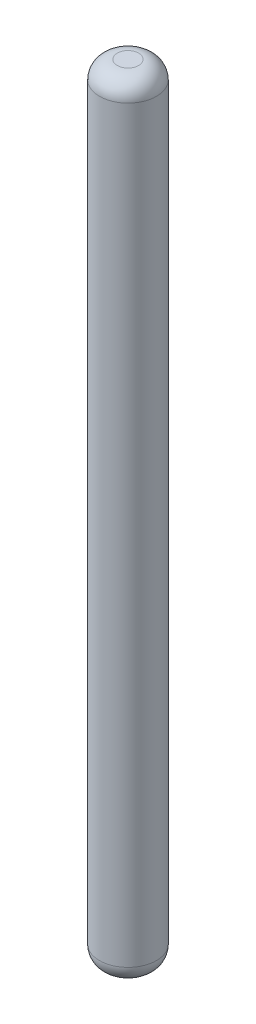
ISO-10303-21;
HEADER;
FILE_DESCRIPTION(('STEP AP214'),'2;1');
FILE_NAME('part.step','',(''),(''),'','','');
FILE_SCHEMA(('AUTOMOTIVE_DESIGN { 1 0 10303 214 1 1 1 1 }'));
ENDSEC;
DATA;
#1=APPLICATION_CONTEXT('core data for automotive mechanical design processes');
#2=APPLICATION_PROTOCOL_DEFINITION('international standard','automotive_design',2000,#1);
#3=PRODUCT_CONTEXT('',#1,'mechanical');
#4=PRODUCT('Part','Part','',(#3));
#5=PRODUCT_RELATED_PRODUCT_CATEGORY('part','',(#4));
#6=PRODUCT_DEFINITION_FORMATION('','',#4);
#7=PRODUCT_DEFINITION_CONTEXT('part definition',#1,'design');
#8=PRODUCT_DEFINITION('design','',#6,#7);
#9=PRODUCT_DEFINITION_SHAPE('','',#8);
#10=(LENGTH_UNIT() NAMED_UNIT(*) SI_UNIT(.MILLI.,.METRE.));
#11=(NAMED_UNIT(*) PLANE_ANGLE_UNIT() SI_UNIT($,.RADIAN.));
#12=(NAMED_UNIT(*) SI_UNIT($,.STERADIAN.) SOLID_ANGLE_UNIT());
#13=UNCERTAINTY_MEASURE_WITH_UNIT(LENGTH_MEASURE(1.E-05),#10,'distance_accuracy_value','');
#14=(GEOMETRIC_REPRESENTATION_CONTEXT(3) GLOBAL_UNCERTAINTY_ASSIGNED_CONTEXT((#13)) GLOBAL_UNIT_ASSIGNED_CONTEXT((#10,
#11,#12)) REPRESENTATION_CONTEXT('',''));
#15=CARTESIAN_POINT('',(0.,0.,0.));
#16=DIRECTION('',(0.,0.,1.));
#17=DIRECTION('',(1.,0.,0.));
#18=AXIS2_PLACEMENT_3D('',#15,#16,#17);
#19=CARTESIAN_POINT('',(10.5,9.5,-63.6));
#20=DIRECTION('',(0.,1.,0.));
#21=DIRECTION('',(0.,0.,1.));
#22=AXIS2_PLACEMENT_3D('',#19,#20,#21);
#23=PLANE('',#22);
#24=CARTESIAN_POINT('',(1.61000000000003,9.5,-39.62));
#25=CARTESIAN_POINT('',(1.60744651209194,9.5,-39.6200001028681));
#26=CARTESIAN_POINT('',(1.60489274724644,9.5,-39.6199437787435));
#27=CARTESIAN_POINT('',(1.59983109088808,9.5,-39.6197148180346));
#28=CARTESIAN_POINT('',(1.59732311445314,9.5,-39.6195440411938));
#29=CARTESIAN_POINT('',(1.59235295693559,9.5,-39.6190862365407));
#30=CARTESIAN_POINT('',(1.58989062497065,9.5,-39.6188008631841));
#31=CARTESIAN_POINT('',(1.58501186497977,9.5,-39.6181141186023));
#32=CARTESIAN_POINT('',(1.58259523864233,9.5,-39.6177141608727));
#33=CARTESIAN_POINT('',(1.5778079222274,9.5,-39.61679849273));
#34=CARTESIAN_POINT('',(1.57543701386565,9.5,-39.6162839264111));
#35=CARTESIAN_POINT('',(1.57074115159744,9.5,-39.6151393246308));
#36=CARTESIAN_POINT('',(1.56841599031441,9.5,-39.6145101411712));
#37=CARTESIAN_POINT('',(1.56381160458464,9.5,-39.6131366063525));
#38=CARTESIAN_POINT('',(1.56153221753956,9.5,-39.6123928004953));
#39=CARTESIAN_POINT('',(1.55701932905815,9.5,-39.6107903345739));
#40=CARTESIAN_POINT('',(1.55478574456547,9.5,-39.6099319084847));
#41=CARTESIAN_POINT('',(1.55036437479331,9.5,-39.6081005172951));
#42=CARTESIAN_POINT('',(1.54817661957813,9.5,-39.6071274796192));
#43=CARTESIAN_POINT('',(1.54384678862419,9.5,-39.6050671722574));
#44=CARTESIAN_POINT('',(1.54170488632377,9.5,-39.6039795382279));
#45=CARTESIAN_POINT('',(1.53746661304357,9.5,-39.6016903259201));
#46=CARTESIAN_POINT('',(1.5353705839186,9.5,-39.6004881151458));
#47=CARTESIAN_POINT('',(1.53122388209925,9.5,-39.597970013839));
#48=CARTESIAN_POINT('',(1.5291737380422,9.5,-39.5966532535175));
#49=CARTESIAN_POINT('',(1.52511862712928,9.5,-39.5939062707506));
#50=CARTESIAN_POINT('',(1.52311438672497,9.5,-39.5924749770629));
#51=CARTESIAN_POINT('',(1.51915084896923,9.5,-39.5894991579835));
#52=CARTESIAN_POINT('',(1.51719247858552,9.5,-39.5879533993471));
#53=CARTESIAN_POINT('',(1.51332062075441,9.5,-39.5847486480499));
#54=CARTESIAN_POINT('',(1.51140825933711,9.5,-39.5830882968723));
#55=CARTESIAN_POINT('',(1.50762769667119,9.5,-39.5796550536089));
#56=CARTESIAN_POINT('',(1.50576079938284,9.5,-39.5778807278789));
#57=CARTESIAN_POINT('',(1.50212846636643,9.5,-39.5742724654317));
#58=CARTESIAN_POINT('',(1.50036210142997,9.5,-39.5724394649763));
#59=CARTESIAN_POINT('',(1.4969444659916,9.5,-39.5687214186444));
#60=CARTESIAN_POINT('',(1.49529183016129,9.5,-39.5668376302416));
#61=CARTESIAN_POINT('',(1.49210102641808,9.5,-39.5630187875233));
#62=CARTESIAN_POINT('',(1.49056160635199,9.5,-39.5610847804152));
#63=CARTESIAN_POINT('',(1.48759726126055,9.5,-39.5571655578271));
#64=CARTESIAN_POINT('',(1.48617122702663,9.5,-39.555181182311));
#65=CARTESIAN_POINT('',(1.48343345919062,9.5,-39.5511614788336));
#66=CARTESIAN_POINT('',(1.48212080175002,9.5,-39.5491267806337));
#67=CARTESIAN_POINT('',(1.47960960054593,9.5,-39.545006635826));
#68=CARTESIAN_POINT('',(1.47841035603885,9.5,-39.5429216166235));
#69=CARTESIAN_POINT('',(1.47612574384802,9.5,-39.5387010374213));
#70=CARTESIAN_POINT('',(1.47503993255191,9.5,-39.5365657176602));
#71=CARTESIAN_POINT('',(1.47298192087012,9.5,-39.5322447235918));
#72=CARTESIAN_POINT('',(1.47200956138047,9.5,-39.5300591250762));
#73=CARTESIAN_POINT('',(1.47017816157946,9.5,-39.5256377354635));
#74=CARTESIAN_POINT('',(1.46931926563915,9.5,-39.5234018845762));
#75=CARTESIAN_POINT('',(1.46771448499594,9.5,-39.5188801208621));
#76=CARTESIAN_POINT('',(1.46696905738754,9.5,-39.5165940459072));
#77=CARTESIAN_POINT('',(1.46559090102852,9.5,-39.5119719297241));
#78=CARTESIAN_POINT('',(1.46495894112589,9.5,-39.5096356595096));
#79=CARTESIAN_POINT('',(1.463807406325,9.5,-39.5049132121102));
#80=CARTESIAN_POINT('',(1.46328890108067,9.5,-39.5025267745638));
#81=CARTESIAN_POINT('',(1.46236399808551,9.5,-39.4977040149967));
#82=CARTESIAN_POINT('',(1.46195895125938,9.5,-39.4952674346405));
#83=CARTESIAN_POINT('',(1.46126062584317,9.5,-39.4903443821916));
#84=CARTESIAN_POINT('',(1.46096895137228,9.5,-39.4878576834758));
#85=CARTESIAN_POINT('',(1.46049738146049,9.5,-39.4828343450856));
#86=CARTESIAN_POINT('',(1.46031931587253,9.5,-39.4802975349906));
#87=CARTESIAN_POINT('',(1.46007378304414,9.5,-39.4751739509832));
#88=CARTESIAN_POINT('',(1.4600083153332,9.5,-39.4725870827843));
#89=CARTESIAN_POINT('',(1.45999182032496,9.5,-39.4674551234314));
#90=CARTESIAN_POINT('',(1.46003894344701,9.5,-39.464910039222));
#91=CARTESIAN_POINT('',(1.46025150509077,9.5,-39.4598644466054));
#92=CARTESIAN_POINT('',(1.46041508748882,9.5,-39.4573638618781));
#93=CARTESIAN_POINT('',(1.46085938908693,9.5,-39.4524073761319));
#94=CARTESIAN_POINT('',(1.46113848357964,9.5,-39.44995133019));
#95=CARTESIAN_POINT('',(1.46181383613728,9.5,-39.4450839818918));
#96=CARTESIAN_POINT('',(1.46220871641113,9.5,-39.4426724891854));
#97=CARTESIAN_POINT('',(1.46311530953887,9.5,-39.4378942908033));
#98=CARTESIAN_POINT('',(1.46362592435353,9.5,-39.4355273772466));
#99=CARTESIAN_POINT('',(1.46476371352076,9.5,-39.430838349221));
#100=CARTESIAN_POINT('',(1.46539009053054,9.5,-39.4285160415478));
#101=CARTESIAN_POINT('',(1.46675908904791,9.5,-39.423916204601));
#102=CARTESIAN_POINT('',(1.46750122725755,9.5,-39.4216385315893));
#103=CARTESIAN_POINT('',(1.46910142881104,9.5,-39.4171279076458));
#104=CARTESIAN_POINT('',(1.46995932618323,9.5,-39.4148948978464));
#105=CARTESIAN_POINT('',(1.47179072532318,9.5,-39.4104735085983));
#106=CARTESIAN_POINT('',(1.47276437144885,9.5,-39.4082851889549));
#107=CARTESIAN_POINT('',(1.47482695811786,9.5,-39.4039530546982));
#108=CARTESIAN_POINT('',(1.47591633638965,9.5,-39.4018094485927));
#109=CARTESIAN_POINT('',(1.47821009893732,9.5,-39.3975665882407));
#110=CARTESIAN_POINT('',(1.47941518855299,9.5,-39.3954677155934));
#111=CARTESIAN_POINT('',(1.4819401100213,9.5,-39.3913141422314));
#112=CARTESIAN_POINT('',(1.48326088201294,9.5,-39.3892600135484));
#113=CARTESIAN_POINT('',(1.48601695621684,9.5,-39.3851957479128));
#114=CARTESIAN_POINT('',(1.48745339595811,9.5,-39.3831863832268));
#115=CARTESIAN_POINT('',(1.49044057081756,9.5,-39.379211400508));
#116=CARTESIAN_POINT('',(1.49199260003098,9.5,-39.3772467561157));
#117=CARTESIAN_POINT('',(1.495210996867,9.5,-39.3733611874125));
#118=CARTESIAN_POINT('',(1.49687877844787,9.5,-39.3714414360314));
#119=CARTESIAN_POINT('',(1.50032785919818,9.5,-39.3676448004121));
#120=CARTESIAN_POINT('',(1.50211063843425,9.5,-39.3657692628202));
#121=CARTESIAN_POINT('',(1.50572764613806,9.5,-39.3621285781879));
#122=CARTESIAN_POINT('',(1.507560564686,9.5,-39.3603621311592));
#123=CARTESIAN_POINT('',(1.51127855215591,9.5,-39.3569444367261));
#124=CARTESIAN_POINT('',(1.5131623619873,9.5,-39.3552918223728));
#125=CARTESIAN_POINT('',(1.51698122014185,9.5,-39.3521010341007));
#126=CARTESIAN_POINT('',(1.51891522162695,9.5,-39.350561608399));
#127=CARTESIAN_POINT('',(1.52283444015392,9.5,-39.3475972592373));
#128=CARTESIAN_POINT('',(1.52481881715032,9.5,-39.346171226487));
#129=CARTESIAN_POINT('',(1.52883852169986,9.5,-39.3434334597256));
#130=CARTESIAN_POINT('',(1.53087321950861,9.5,-39.342120801893));
#131=CARTESIAN_POINT('',(1.53499336403224,9.5,-39.3396096004042));
#132=CARTESIAN_POINT('',(1.53707838333846,9.5,-39.3384103560011));
#133=CARTESIAN_POINT('',(1.54129896261619,9.5,-39.336125743886));
#134=CARTESIAN_POINT('',(1.54343428234965,9.5,-39.3350399325623));
#135=CARTESIAN_POINT('',(1.54775527639789,9.5,-39.3329819208602));
#136=CARTESIAN_POINT('',(1.54994087492089,9.5,-39.332009561378));
#137=CARTESIAN_POINT('',(1.55436226453899,9.5,-39.3301781615824));
#138=CARTESIAN_POINT('',(1.5565981154243,9.5,-39.3293192656401));
#139=CARTESIAN_POINT('',(1.56111987913695,9.5,-39.3277144849954));
#140=CARTESIAN_POINT('',(1.56340595409241,9.5,-39.3269690573876));
#141=CARTESIAN_POINT('',(1.5680280702759,9.5,-39.3255909010289));
#142=CARTESIAN_POINT('',(1.57036434049023,9.5,-39.3249589411261));
#143=CARTESIAN_POINT('',(1.57508678788953,9.5,-39.3238074063251));
#144=CARTESIAN_POINT('',(1.57747322543599,9.5,-39.3232889010808));
#145=CARTESIAN_POINT('',(1.58229598500317,9.5,-39.3223639980857));
#146=CARTESIAN_POINT('',(1.58473256535939,9.5,-39.3219589512595));
#147=CARTESIAN_POINT('',(1.58965561780831,9.5,-39.3212606258433));
#148=CARTESIAN_POINT('',(1.59214231652412,9.5,-39.3209689513724));
#149=CARTESIAN_POINT('',(1.59716565491428,9.5,-39.3204973814606));
#150=CARTESIAN_POINT('',(1.59970246500938,9.5,-39.3203193158726));
#151=CARTESIAN_POINT('',(1.60482604901677,9.5,-39.3200737830442));
#152=CARTESIAN_POINT('',(1.60741291721574,9.5,-39.3200083153332));
#153=CARTESIAN_POINT('',(1.61254487656858,9.5,-39.3199918203249));
#154=CARTESIAN_POINT('',(1.615089960778,9.5,-39.3200389434469));
#155=CARTESIAN_POINT('',(1.62013555339457,9.5,-39.3202515050907));
#156=CARTESIAN_POINT('',(1.62263613812188,9.5,-39.3204150874887));
#157=CARTESIAN_POINT('',(1.62759262386798,9.5,-39.3208593890868));
#158=CARTESIAN_POINT('',(1.63004866980989,9.5,-39.3211384835795));
#159=CARTESIAN_POINT('',(1.63491601810802,9.5,-39.3218138361371));
#160=CARTESIAN_POINT('',(1.63732751081448,9.5,-39.3222087164109));
#161=CARTESIAN_POINT('',(1.6421057091965,9.5,-39.3231153095386));
#162=CARTESIAN_POINT('',(1.64447262275325,9.5,-39.3236259243533));
#163=CARTESIAN_POINT('',(1.64916165077883,9.5,-39.3247637135205));
#164=CARTESIAN_POINT('',(1.65148395845201,9.5,-39.3253900905303));
#165=CARTESIAN_POINT('',(1.65608379539879,9.5,-39.3267590890476));
#166=CARTESIAN_POINT('',(1.65836146841052,9.5,-39.3275012272573));
#167=CARTESIAN_POINT('',(1.66287209235394,9.5,-39.3291014288108));
#168=CARTESIAN_POINT('',(1.6651051021534,9.5,-39.3299593261829));
#169=CARTESIAN_POINT('',(1.66952649140149,9.5,-39.3317907253229));
#170=CARTESIAN_POINT('',(1.6717148110449,9.5,-39.3327643714486));
#171=CARTESIAN_POINT('',(1.6760469453016,9.5,-39.3348269581176));
#172=CARTESIAN_POINT('',(1.67819055140706,9.5,-39.3359163363894));
#173=CARTESIAN_POINT('',(1.68243341175914,9.5,-39.3382100989371));
#174=CARTESIAN_POINT('',(1.68453228440643,9.5,-39.3394151885527));
#175=CARTESIAN_POINT('',(1.68868585776845,9.5,-39.3419401100211));
#176=CARTESIAN_POINT('',(1.69073998645147,9.5,-39.3432608820127));
#177=CARTESIAN_POINT('',(1.69480425208708,9.5,-39.3460169562166));
#178=CARTESIAN_POINT('',(1.69681361677311,9.5,-39.3474533959579));
#179=CARTESIAN_POINT('',(1.70078859949192,9.5,-39.3504405708174));
#180=CARTESIAN_POINT('',(1.70275324388423,9.5,-39.3519926000308));
#181=CARTESIAN_POINT('',(1.70663881258747,9.5,-39.3552109968669));
#182=CARTESIAN_POINT('',(1.70855856396851,9.5,-39.3568787784478));
#183=CARTESIAN_POINT('',(1.71235519958786,9.5,-39.3603278591981));
#184=CARTESIAN_POINT('',(1.71423073717978,9.5,-39.3621106384342));
#185=CARTESIAN_POINT('',(1.71787142181219,9.5,-39.3657276461381));
#186=CARTESIAN_POINT('',(1.7196378688409,9.5,-39.367560564686));
#187=CARTESIAN_POINT('',(1.72305556327403,9.5,-39.371278552156));
#188=CARTESIAN_POINT('',(1.72470817762734,9.5,-39.3731623619874));
#189=CARTESIAN_POINT('',(1.72789896589945,9.5,-39.3769812201419));
#190=CARTESIAN_POINT('',(1.72943839160121,9.5,-39.3789152216271));
#191=CARTESIAN_POINT('',(1.73240274076293,9.5,-39.3828344401541));
#192=CARTESIAN_POINT('',(1.73382877351317,9.5,-39.3848188171505));
#193=CARTESIAN_POINT('',(1.73656654027462,9.5,-39.3888385217));
#194=CARTESIAN_POINT('',(1.7378791981072,9.5,-39.3908732195088));
#195=CARTESIAN_POINT('',(1.74039039959603,9.5,-39.3949933640324));
#196=CARTESIAN_POINT('',(1.74158964399916,9.5,-39.3970783833387));
#197=CARTESIAN_POINT('',(1.74387425611425,9.5,-39.4012989626164));
#198=CARTESIAN_POINT('',(1.74496006743803,9.5,-39.4034342823499));
#199=CARTESIAN_POINT('',(1.74701807914004,9.5,-39.4077552763981));
#200=CARTESIAN_POINT('',(1.7479904386223,9.5,-39.4099408749211));
#201=CARTESIAN_POINT('',(1.74982183841789,9.5,-39.4143622645392));
#202=CARTESIAN_POINT('',(1.75068073436018,9.5,-39.4165981154245));
#203=CARTESIAN_POINT('',(1.75228551500485,9.5,-39.4211198791372));
#204=CARTESIAN_POINT('',(1.75303094261272,9.5,-39.4234059540926));
#205=CARTESIAN_POINT('',(1.75440909897134,9.5,-39.4280280702761));
#206=CARTESIAN_POINT('',(1.75504105887412,9.5,-39.4303643404904));
#207=CARTESIAN_POINT('',(1.75619259367511,9.5,-39.4350867878897));
#208=CARTESIAN_POINT('',(1.75671109891941,9.5,-39.4374732254362));
#209=CARTESIAN_POINT('',(1.75763600191454,9.5,-39.4422959850033));
#210=CARTESIAN_POINT('',(1.75804104874067,9.5,-39.4447325653595));
#211=CARTESIAN_POINT('',(1.7587393741569,9.5,-39.4496556178084));
#212=CARTESIAN_POINT('',(1.75903104862778,9.5,-39.4521423165242));
#213=CARTESIAN_POINT('',(1.75950261853956,9.5,-39.4571656549143));
#214=CARTESIAN_POINT('',(1.75968068412753,9.5,-39.4597024650094));
#215=CARTESIAN_POINT('',(1.75992621695592,9.5,-39.4648260490168));
#216=CARTESIAN_POINT('',(1.75999168466686,9.5,-39.4674129172157));
#217=CARTESIAN_POINT('',(1.7600081796751,9.5,-39.4725448765686));
#218=CARTESIAN_POINT('',(1.75996105655305,9.5,-39.475089960778));
#219=CARTESIAN_POINT('',(1.75974849490929,9.5,-39.4801355533945));
#220=CARTESIAN_POINT('',(1.75958491251125,9.5,-39.4826361381218));
#221=CARTESIAN_POINT('',(1.75914061091313,9.5,-39.487592623868));
#222=CARTESIAN_POINT('',(1.75886151642042,9.5,-39.4900486698099));
#223=CARTESIAN_POINT('',(1.75818616386277,9.5,-39.494916018108));
#224=CARTESIAN_POINT('',(1.75779128358891,9.5,-39.4973275108144));
#225=CARTESIAN_POINT('',(1.7568846904612,9.5,-39.5021057091965));
#226=CARTESIAN_POINT('',(1.75637407564659,9.5,-39.5044726227533));
#227=CARTESIAN_POINT('',(1.75523628647924,9.5,-39.5091616507787));
#228=CARTESIAN_POINT('',(1.75460990946932,9.5,-39.5114839584518));
#229=CARTESIAN_POINT('',(1.75324091095236,9.5,-39.5160837953989));
#230=CARTESIAN_POINT('',(1.75249877274327,9.5,-39.5183614684112));
#231=CARTESIAN_POINT('',(1.75089857118827,9.5,-39.5228720923532));
#232=CARTESIAN_POINT('',(1.750040673814,9.5,-39.5251051021506));
#233=CARTESIAN_POINT('',(1.74820927467971,9.5,-39.5295264914042));
#234=CARTESIAN_POINT('',(1.74723562856179,9.5,-39.5317148110553));
#235=CARTESIAN_POINT('',(1.74517304187158,9.5,-39.5360469452911));
#236=CARTESIAN_POINT('',(1.74408366357071,9.5,-39.538190551368));
#237=CARTESIAN_POINT('',(1.7417899011027,9.5,-39.5424334117984));
#238=CARTESIAN_POINT('',(1.74058481159668,9.5,-39.5445322845534));
#239=CARTESIAN_POINT('',(1.73805988982779,9.5,-39.54868585762));
#240=CARTESIAN_POINT('',(1.73673911742123,9.5,-39.5507399858953));
#241=CARTESIAN_POINT('',(1.73398304435559,9.5,-39.5548042526496));
#242=CARTESIAN_POINT('',(1.73254660619009,9.5,-39.5568136188842));
#243=CARTESIAN_POINT('',(1.72955942700499,9.5,-39.5607885973519));
#244=CARTESIAN_POINT('',(1.72800739178761,9.5,-39.5627532358436));
#245=CARTESIAN_POINT('',(1.72478901144316,9.5,-39.5666388207545));
#246=CARTESIAN_POINT('',(1.72312125280734,9.5,-39.5685585946855));
#247=CARTESIAN_POINT('',(1.71967210899735,9.5,-39.5723551683308));
#248=CARTESIAN_POINT('',(1.71788924183437,9.5,-39.5742306195096));
#249=CARTESIAN_POINT('',(1.7142638654174,9.5,-39.5778802012545));
#250=CARTESIAN_POINT('',(1.71242228367882,9.5,-39.5796552523496));
#251=CARTESIAN_POINT('',(1.7086881772379,9.5,-39.5830890612037));
#252=CARTESIAN_POINT('',(1.70679695739657,9.5,-39.5847492350905));
#253=CARTESIAN_POINT('',(1.70296434914565,9.5,-39.5879539057828));
#254=CARTESIAN_POINT('',(1.70102405652543,9.5,-39.5894997117967));
#255=CARTESIAN_POINT('',(1.69709335993836,9.5,-39.5924756142827));
#256=CARTESIAN_POINT('',(1.69510384468509,9.5,-39.5939068831367));
#257=CARTESIAN_POINT('',(1.69107495886129,9.5,-39.5966538995756));
#258=CARTESIAN_POINT('',(1.68903626538221,9.5,-39.5979706392831));
#259=CARTESIAN_POINT('',(1.68490922913308,9.5,-39.6004887797272));
#260=CARTESIAN_POINT('',(1.68282135825714,9.5,-39.6016909532521));
#261=CARTESIAN_POINT('',(1.67859617819762,9.5,-39.6039801949447));
#262=CARTESIAN_POINT('',(1.67645914961905,9.5,-39.6050677807397));
#263=CARTESIAN_POINT('',(1.67213584505498,9.5,-39.6071281115684));
#264=CARTESIAN_POINT('',(1.66994968014243,9.5,-39.6081010896125));
#265=CARTESIAN_POINT('',(1.66552827043575,9.5,-39.6099324976137));
#266=CARTESIAN_POINT('',(1.66329299549152,9.5,-39.6107908547758));
#267=CARTESIAN_POINT('',(1.65877350228138,9.5,-39.6123933317798));
#268=CARTESIAN_POINT('',(1.65648914579257,9.5,-39.6131370615934));
#269=CARTESIAN_POINT('',(1.6518715913684,9.5,-39.6145106026434));
#270=CARTESIAN_POINT('',(1.64953818297947,9.5,-39.615139705644));
#271=CARTESIAN_POINT('',(1.64482258850498,9.5,-39.6162843098821));
#272=CARTESIAN_POINT('',(1.64244015596074,9.5,-39.6167987940126));
#273=CARTESIAN_POINT('',(1.63762654399496,9.5,-39.6177144622634));
#274=CARTESIAN_POINT('',(1.6351951165959,9.5,-39.6181143390691));
#275=CARTESIAN_POINT('',(1.63028349681383,9.5,-39.6188010817034));
#276=CARTESIAN_POINT('',(1.62780308559003,9.5,-39.6190863765723));
#277=CARTESIAN_POINT('',(1.62279350544139,9.5,-39.6195441815449));
#278=CARTESIAN_POINT('',(1.62026417352486,9.5,-39.6197148887649));
#279=CARTESIAN_POINT('',(1.61515652257125,9.5,-39.619943840581));
#280=CARTESIAN_POINT('',(1.61257811310772,9.5,-39.6200000883383));
#281=CARTESIAN_POINT('',(1.61000000000003,9.5,-39.62));
#282=B_SPLINE_CURVE_WITH_KNOTS('',3,(#24,#25,#26,#27,#28,#29,#30,#31,#32,#33,#34,#35,#36,#37,
#38,#39,#40,#41,#42,#43,#44,#45,#46,#47,#48,#49,#50,#51,#52,#53,#54,#55,#56,#57,#58,#59,#60,#61,
#62,#63,#64,#65,#66,#67,#68,#69,#70,#71,#72,#73,#74,#75,#76,#77,#78,#79,#80,#81,#82,#83,#84,#85,
#86,#87,#88,#89,#90,#91,#92,#93,#94,#95,#96,#97,#98,#99,#100,#101,#102,#103,#104,#105,#106,#107,
#108,#109,#110,#111,#112,#113,#114,#115,#116,#117,#118,#119,#120,#121,#122,#123,#124,#125,#126,
#127,#128,#129,#130,#131,#132,#133,#134,#135,#136,#137,#138,#139,#140,#141,#142,#143,#144,#145,
#146,#147,#148,#149,#150,#151,#152,#153,#154,#155,#156,#157,#158,#159,#160,#161,#162,#163,#164,
#165,#166,#167,#168,#169,#170,#171,#172,#173,#174,#175,#176,#177,#178,#179,#180,#181,#182,#183,
#184,#185,#186,#187,#188,#189,#190,#191,#192,#193,#194,#195,#196,#197,#198,#199,#200,#201,#202,
#203,#204,#205,#206,#207,#208,#209,#210,#211,#212,#213,#214,#215,#216,#217,#218,#219,#220,#221,
#222,#223,#224,#225,#226,#227,#228,#229,#230,#231,#232,#233,#234,#235,#236,#237,#238,#239,#240,
#241,#242,#243,#244,#245,#246,#247,#248,#249,#250,#251,#252,#253,#254,#255,#256,#257,#258,#259,
#260,#261,#262,#263,#264,#265,#266,#267,#268,#269,#270,#271,#272,#273,#274,#275,#276,#277,#278,
#279,#280,#281),.UNSPECIFIED.,.F.,.F.,(4,2,2,2,2,2,2,2,2,2,2,2,2,2,2,2,2,2,2,2,2,2,2,2,2,2,2,2,
2,2,2,2,2,2,2,2,2,2,2,2,2,2,2,2,2,2,2,2,2,2,2,2,2,2,2,2,2,2,2,2,2,2,2,2,2,2,2,2,2,2,2,2,2,2,2,2,
2,2,2,2,2,2,2,2,2,2,2,2,2,2,2,2,2,2,2,2,2,2,2,2,2,2,2,2,2,2,2,2,2,2,2,2,2,2,2,2,2,2,2,2,2,2,2,2,
2,2,2,2,4),(0.,0.00766024285048307,0.0151989384589449,0.0226324990996453,0.0299780417953489,
0.0372533048533554,0.0444765443624254,0.0516664127076069,0.058841822522387,0.0660218006959215,
0.0732253379178876,0.0804712396435128,0.0877779842332801,0.0951635933859558,0.102645518939281,
0.110240548813365,0.117964733492965,0.125598856614338,0.133113923327842,0.140526670390782,
0.147854535684583,0.155115568665086,0.162328320536456,0.16951171657223,0.176684914400954,
0.183867153258563,0.191077600010328,0.198335198039065,0.205658524835551,0.213065663353493,
0.220574091026063,0.228200588953631,0.235961172346553,0.243595147940672,0.25111010135415,
0.258522765449477,0.265850573847715,0.273111571410083,0.280324304458538,0.287507693157725,
0.294680889873785,0.301863128508003,0.309073570603918,0.316331154319332,0.323654452094382,
0.331061542073985,0.33856989717866,0.346196294331825,0.353956744927367,0.361590868048653,
0.369105934762086,0.376518681824964,0.383846547118718,0.391107580099177,0.398320331970529,
0.405503728006282,0.412676925835,0.419859164692615,0.427069611444393,0.434327209473161,
0.441650536269679,0.449057674787659,0.456566102460282,0.464192600387904,0.471953183780889,
0.479587159374949,0.487102112788373,0.494514776883646,0.50184258528185,0.509103582844189,
0.516316315892614,0.523499704591794,0.530672901307843,0.537855139942067,0.545065582037999,
0.552323165753442,0.559646463528534,0.567053553508187,0.574561908612915,0.58218830576616,
0.589948756361783,0.597582879483156,0.605097946196658,0.612510693259593,0.619838558553401,
0.627099591533897,0.634312343405275,0.641495739441048,0.648668937269771,0.655851176127374,
0.663061622879139,0.670319220907882,0.677642547704369,0.685049686222303,0.692558113894881,
0.700184611822442,0.70794519521537,0.715579170809427,0.723094124222864,0.730506788318135,
0.737834596716346,0.745095594278686,0.752308327327121,0.759491716026295,0.766664912742355,
0.773847151376573,0.781057593472501,0.788315177187932,0.795638474963007,0.803045564942637,
0.81055392004735,0.818180317200552,0.825940767796135,0.83361152282638,0.841158269728823,
0.848597703938477,0.855947252250081,0.863224987191948,0.870449520246617,0.877639876031048,
0.884815351013931,0.8919953616426,0.899199287690271,0.906446317071153,0.913755298236063,
0.921144605576091,0.928632022135645,0.936234642537964,0.943968797546881),.UNSPECIFIED.);
#283=CARTESIAN_POINT('',(1.61000000000003,9.5,-39.62));
#284=VERTEX_POINT('',#283);
#285=EDGE_CURVE('E19',#284,#284,#282,.T.);
#286=ORIENTED_EDGE('',*,*,#285,.T.);
#287=EDGE_LOOP('',(#286));
#288=FACE_BOUND('',#287,.T.);
#289=ADVANCED_FACE('F15',(#288),#23,.T.);
#290=CARTESIAN_POINT('',(10.5,-1.5,-63.6));
#291=DIRECTION('',(0.,1.,0.));
#292=DIRECTION('',(0.,0.,1.));
#293=AXIS2_PLACEMENT_3D('',#290,#291,#292);
#294=PLANE('',#293);
#295=CARTESIAN_POINT('',(1.61000000000003,-1.5,-39.32));
#296=CARTESIAN_POINT('',(1.61255348790812,-1.5,-39.3199998971319));
#297=CARTESIAN_POINT('',(1.61510725275362,-1.5,-39.3200562212565));
#298=CARTESIAN_POINT('',(1.62016890911198,-1.5,-39.3202851819654));
#299=CARTESIAN_POINT('',(1.62267688554692,-1.5,-39.3204559588062));
#300=CARTESIAN_POINT('',(1.62764704306447,-1.5,-39.3209137634593));
#301=CARTESIAN_POINT('',(1.63010937502941,-1.5,-39.3211991368158));
#302=CARTESIAN_POINT('',(1.63498813502029,-1.5,-39.3218858813977));
#303=CARTESIAN_POINT('',(1.63740476135773,-1.5,-39.3222858391273));
#304=CARTESIAN_POINT('',(1.64219207777266,-1.5,-39.32320150727));
#305=CARTESIAN_POINT('',(1.64456298613441,-1.5,-39.3237160735889));
#306=CARTESIAN_POINT('',(1.64925884840262,-1.5,-39.3248606753692));
#307=CARTESIAN_POINT('',(1.65158400968565,-1.5,-39.3254898588288));
#308=CARTESIAN_POINT('',(1.65618839541542,-1.5,-39.3268633936475));
#309=CARTESIAN_POINT('',(1.6584677824605,-1.5,-39.3276071995047));
#310=CARTESIAN_POINT('',(1.66298067094191,-1.5,-39.3292096654261));
#311=CARTESIAN_POINT('',(1.66521425543459,-1.5,-39.3300680915153));
#312=CARTESIAN_POINT('',(1.66963562520675,-1.5,-39.3318994827049));
#313=CARTESIAN_POINT('',(1.67182338042193,-1.5,-39.3328725203808));
#314=CARTESIAN_POINT('',(1.67615321137587,-1.5,-39.3349328277425));
#315=CARTESIAN_POINT('',(1.67829511367629,-1.5,-39.3360204617721));
#316=CARTESIAN_POINT('',(1.68253338695649,-1.5,-39.3383096740799));
#317=CARTESIAN_POINT('',(1.68462941608146,-1.5,-39.3395118848542));
#318=CARTESIAN_POINT('',(1.68877611790081,-1.5,-39.342029986161));
#319=CARTESIAN_POINT('',(1.69082626195786,-1.5,-39.3433467464825));
#320=CARTESIAN_POINT('',(1.69488137287078,-1.5,-39.3460937292494));
#321=CARTESIAN_POINT('',(1.69688561327509,-1.5,-39.3475250229371));
#322=CARTESIAN_POINT('',(1.70084915103083,-1.5,-39.3505008420165));
#323=CARTESIAN_POINT('',(1.70280752141454,-1.5,-39.3520466006529));
#324=CARTESIAN_POINT('',(1.70667937924565,-1.5,-39.3552513519501));
#325=CARTESIAN_POINT('',(1.70859174066295,-1.5,-39.3569117031277));
#326=CARTESIAN_POINT('',(1.71237230332887,-1.5,-39.3603449463911));
#327=CARTESIAN_POINT('',(1.71423920061722,-1.5,-39.3621192721211));
#328=CARTESIAN_POINT('',(1.71787153363363,-1.5,-39.3657275345683));
#329=CARTESIAN_POINT('',(1.71963789857009,-1.5,-39.3675605350237));
#330=CARTESIAN_POINT('',(1.72305553400847,-1.5,-39.3712785813556));
#331=CARTESIAN_POINT('',(1.72470816983877,-1.5,-39.3731623697584));
#332=CARTESIAN_POINT('',(1.72789897358198,-1.5,-39.3769812124767));
#333=CARTESIAN_POINT('',(1.72943839364807,-1.5,-39.3789152195848));
#334=CARTESIAN_POINT('',(1.73240273873951,-1.5,-39.3828344421729));
#335=CARTESIAN_POINT('',(1.73382877297343,-1.5,-39.384818817689));
#336=CARTESIAN_POINT('',(1.73656654080944,-1.5,-39.3888385211664));
#337=CARTESIAN_POINT('',(1.73787919825004,-1.5,-39.3908732193663));
#338=CARTESIAN_POINT('',(1.74039039945413,-1.5,-39.394993364174));
#339=CARTESIAN_POINT('',(1.74158964396122,-1.5,-39.3970783833765));
#340=CARTESIAN_POINT('',(1.74387425615204,-1.5,-39.4012989625787));
#341=CARTESIAN_POINT('',(1.74496006744815,-1.5,-39.4034342823398));
#342=CARTESIAN_POINT('',(1.74701807912994,-1.5,-39.4077552764082));
#343=CARTESIAN_POINT('',(1.74799043861959,-1.5,-39.4099408749238));
#344=CARTESIAN_POINT('',(1.7498218384206,-1.5,-39.4143622645365));
#345=CARTESIAN_POINT('',(1.75068073436091,-1.5,-39.4165981154238));
#346=CARTESIAN_POINT('',(1.75228551500412,-1.5,-39.4211198791379));
#347=CARTESIAN_POINT('',(1.75303094261252,-1.5,-39.4234059540928));
#348=CARTESIAN_POINT('',(1.75440909897154,-1.5,-39.4280280702759));
#349=CARTESIAN_POINT('',(1.75504105887417,-1.5,-39.4303643404904));
#350=CARTESIAN_POINT('',(1.75619259367505,-1.5,-39.4350867878898));
#351=CARTESIAN_POINT('',(1.75671109891939,-1.5,-39.4374732254362));
#352=CARTESIAN_POINT('',(1.75763600191455,-1.5,-39.4422959850033));
#353=CARTESIAN_POINT('',(1.75804104874068,-1.5,-39.4447325653595));
#354=CARTESIAN_POINT('',(1.75873937415689,-1.5,-39.4496556178084));
#355=CARTESIAN_POINT('',(1.75903104862778,-1.5,-39.4521423165242));
#356=CARTESIAN_POINT('',(1.75950261853957,-1.5,-39.4571656549143));
#357=CARTESIAN_POINT('',(1.75968068412753,-1.5,-39.4597024650094));
#358=CARTESIAN_POINT('',(1.75992621695592,-1.5,-39.4648260490168));
#359=CARTESIAN_POINT('',(1.75999168466686,-1.5,-39.4674129172157));
#360=CARTESIAN_POINT('',(1.7600081796751,-1.5,-39.4725448765686));
#361=CARTESIAN_POINT('',(1.75996105655305,-1.5,-39.475089960778));
#362=CARTESIAN_POINT('',(1.75974849490929,-1.5,-39.4801355533945));
#363=CARTESIAN_POINT('',(1.75958491251125,-1.5,-39.4826361381218));
#364=CARTESIAN_POINT('',(1.75914061091313,-1.5,-39.487592623868));
#365=CARTESIAN_POINT('',(1.75886151642042,-1.5,-39.4900486698099));
#366=CARTESIAN_POINT('',(1.75818616386278,-1.5,-39.494916018108));
#367=CARTESIAN_POINT('',(1.75779128358893,-1.5,-39.4973275108144));
#368=CARTESIAN_POINT('',(1.75688469046119,-1.5,-39.5021057091965));
#369=CARTESIAN_POINT('',(1.75637407564654,-1.5,-39.5044726227532));
#370=CARTESIAN_POINT('',(1.7552362864793,-1.5,-39.5091616507788));
#371=CARTESIAN_POINT('',(1.75460990946952,-1.5,-39.511483958452));
#372=CARTESIAN_POINT('',(1.75324091095215,-1.5,-39.5160837953988));
#373=CARTESIAN_POINT('',(1.75249877274251,-1.5,-39.5183614684105));
#374=CARTESIAN_POINT('',(1.75089857118903,-1.5,-39.5228720923539));
#375=CARTESIAN_POINT('',(1.75004067381683,-1.5,-39.5251051021534));
#376=CARTESIAN_POINT('',(1.74820927467688,-1.5,-39.5295264914014));
#377=CARTESIAN_POINT('',(1.74723562855122,-1.5,-39.5317148110449));
#378=CARTESIAN_POINT('',(1.7451730418822,-1.5,-39.5360469453016));
#379=CARTESIAN_POINT('',(1.74408366361041,-1.5,-39.538190551407));
#380=CARTESIAN_POINT('',(1.74178990106274,-1.5,-39.5424334117591));
#381=CARTESIAN_POINT('',(1.74058481144708,-1.5,-39.5445322844064));
#382=CARTESIAN_POINT('',(1.73805988997876,-1.5,-39.5486858577684));
#383=CARTESIAN_POINT('',(1.73673911798712,-1.5,-39.5507399864514));
#384=CARTESIAN_POINT('',(1.73398304378322,-1.5,-39.554804252087));
#385=CARTESIAN_POINT('',(1.73254660404195,-1.5,-39.5568136167731));
#386=CARTESIAN_POINT('',(1.7295594291825,-1.5,-39.5607885994919));
#387=CARTESIAN_POINT('',(1.72800739996908,-1.5,-39.5627532438842));
#388=CARTESIAN_POINT('',(1.72478900313306,-1.5,-39.5666388125874));
#389=CARTESIAN_POINT('',(1.72312122155219,-1.5,-39.5685585639685));
#390=CARTESIAN_POINT('',(1.71967214080188,-1.5,-39.5723551995878));
#391=CARTESIAN_POINT('',(1.71788936156581,-1.5,-39.5742307371797));
#392=CARTESIAN_POINT('',(1.714272353862,-1.5,-39.5778714218121));
#393=CARTESIAN_POINT('',(1.71243943531407,-1.5,-39.5796378688408));
#394=CARTESIAN_POINT('',(1.70872144784417,-1.5,-39.583055563274));
#395=CARTESIAN_POINT('',(1.70683763801279,-1.5,-39.5847081776273));
#396=CARTESIAN_POINT('',(1.70301877985823,-1.5,-39.5878989658994));
#397=CARTESIAN_POINT('',(1.70108477837314,-1.5,-39.5894383916011));
#398=CARTESIAN_POINT('',(1.69716555984617,-1.5,-39.5924027407629));
#399=CARTESIAN_POINT('',(1.69518118284977,-1.5,-39.5938287735131));
#400=CARTESIAN_POINT('',(1.69116147830024,-1.5,-39.5965665402745));
#401=CARTESIAN_POINT('',(1.68912678049148,-1.5,-39.5978791981071));
#402=CARTESIAN_POINT('',(1.68500663596786,-1.5,-39.6003903995959));
#403=CARTESIAN_POINT('',(1.68292161666164,-1.5,-39.6015896439991));
#404=CARTESIAN_POINT('',(1.67870103738391,-1.5,-39.6038742561142));
#405=CARTESIAN_POINT('',(1.67656571765045,-1.5,-39.604960067438));
#406=CARTESIAN_POINT('',(1.67224472360222,-1.5,-39.60701807914));
#407=CARTESIAN_POINT('',(1.67005912507921,-1.5,-39.6079904386222));
#408=CARTESIAN_POINT('',(1.66563773546112,-1.5,-39.6098218384178));
#409=CARTESIAN_POINT('',(1.66340188457581,-1.5,-39.6106807343601));
#410=CARTESIAN_POINT('',(1.65888012086315,-1.5,-39.6122855150048));
#411=CARTESIAN_POINT('',(1.65659404590769,-1.5,-39.6130309426126));
#412=CARTESIAN_POINT('',(1.6519719297242,-1.5,-39.6144090989713));
#413=CARTESIAN_POINT('',(1.64963565950987,-1.5,-39.615041058874));
#414=CARTESIAN_POINT('',(1.64491321211057,-1.5,-39.616192593675));
#415=CARTESIAN_POINT('',(1.6425267745641,-1.5,-39.6167110989193));
#416=CARTESIAN_POINT('',(1.63770401499692,-1.5,-39.6176360019145));
#417=CARTESIAN_POINT('',(1.6352674346407,-1.5,-39.6180410487406));
#418=CARTESIAN_POINT('',(1.63034438219177,-1.5,-39.6187393741568));
#419=CARTESIAN_POINT('',(1.62785768347597,-1.5,-39.6190310486277));
#420=CARTESIAN_POINT('',(1.62283434508579,-1.5,-39.6195026185395));
#421=CARTESIAN_POINT('',(1.6202975349907,-1.5,-39.6196806841275));
#422=CARTESIAN_POINT('',(1.6151739509833,-1.5,-39.6199262169559));
#423=CARTESIAN_POINT('',(1.61258708278433,-1.5,-39.6199916846668));
#424=CARTESIAN_POINT('',(1.60745512343146,-1.5,-39.6200081796751));
#425=CARTESIAN_POINT('',(1.60491003922203,-1.5,-39.619961056553));
#426=CARTESIAN_POINT('',(1.59986444660543,-1.5,-39.6197484949093));
#427=CARTESIAN_POINT('',(1.59736386187811,-1.5,-39.6195849125112));
#428=CARTESIAN_POINT('',(1.59240737613197,-1.5,-39.6191406109131));
#429=CARTESIAN_POINT('',(1.58995133019006,-1.5,-39.6188615164204));
#430=CARTESIAN_POINT('',(1.58508398189191,-1.5,-39.6181861638628));
#431=CARTESIAN_POINT('',(1.58267248918544,-1.5,-39.6177912835889));
#432=CARTESIAN_POINT('',(1.57789429080341,-1.5,-39.6168846904612));
#433=CARTESIAN_POINT('',(1.57552737724664,-1.5,-39.6163740756465));
#434=CARTESIAN_POINT('',(1.57083834922105,-1.5,-39.6152362864793));
#435=CARTESIAN_POINT('',(1.56851604154787,-1.5,-39.6146099094695));
#436=CARTESIAN_POINT('',(1.56391620460108,-1.5,-39.6132409109522));
#437=CARTESIAN_POINT('',(1.56163853158935,-1.5,-39.6124987727425));
#438=CARTESIAN_POINT('',(1.55712790764592,-1.5,-39.610898571189));
#439=CARTESIAN_POINT('',(1.55489489784646,-1.5,-39.6100406738168));
#440=CARTESIAN_POINT('',(1.55047350859837,-1.5,-39.6082092746769));
#441=CARTESIAN_POINT('',(1.54828518895496,-1.5,-39.6072356285512));
#442=CARTESIAN_POINT('',(1.54395305469826,-1.5,-39.6051730418822));
#443=CARTESIAN_POINT('',(1.54180944859281,-1.5,-39.6040836636104));
#444=CARTESIAN_POINT('',(1.53756658824074,-1.5,-39.6017899010628));
#445=CARTESIAN_POINT('',(1.53546771559345,-1.5,-39.6005848114471));
#446=CARTESIAN_POINT('',(1.53131414223144,-1.5,-39.5980598899788));
#447=CARTESIAN_POINT('',(1.52926001354843,-1.5,-39.5967391179871));
#448=CARTESIAN_POINT('',(1.52519574791284,-1.5,-39.5939830437832));
#449=CARTESIAN_POINT('',(1.52318638322682,-1.5,-39.5925466040419));
#450=CARTESIAN_POINT('',(1.51921140050803,-1.5,-39.5895594291825));
#451=CARTESIAN_POINT('',(1.51724675611573,-1.5,-39.5880073999691));
#452=CARTESIAN_POINT('',(1.51336118741252,-1.5,-39.584789003133));
#453=CARTESIAN_POINT('',(1.51144143603149,-1.5,-39.5831212215522));
#454=CARTESIAN_POINT('',(1.50764480041217,-1.5,-39.5796721408019));
#455=CARTESIAN_POINT('',(1.50576926282026,-1.5,-39.5778893615658));
#456=CARTESIAN_POINT('',(1.50212857818787,-1.5,-39.5742723538619));
#457=CARTESIAN_POINT('',(1.50036213115917,-1.5,-39.572439435314));
#458=CARTESIAN_POINT('',(1.49694443672603,-1.5,-39.568721447844));
#459=CARTESIAN_POINT('',(1.49529182237272,-1.5,-39.5668376380126));
#460=CARTESIAN_POINT('',(1.49210103410061,-1.5,-39.563018779858));
#461=CARTESIAN_POINT('',(1.49056160839885,-1.5,-39.5610847783729));
#462=CARTESIAN_POINT('',(1.48759725923713,-1.5,-39.5571655598459));
#463=CARTESIAN_POINT('',(1.48617122648689,-1.5,-39.5551811828495));
#464=CARTESIAN_POINT('',(1.48343345972544,-1.5,-39.5511614783));
#465=CARTESIAN_POINT('',(1.48212080189286,-1.5,-39.5491267804912));
#466=CARTESIAN_POINT('',(1.47960960040404,-1.5,-39.5450066359676));
#467=CARTESIAN_POINT('',(1.4784103560009,-1.5,-39.5429216166613));
#468=CARTESIAN_POINT('',(1.47612574388581,-1.5,-39.5387010373836));
#469=CARTESIAN_POINT('',(1.47503993256203,-1.5,-39.5365657176501));
#470=CARTESIAN_POINT('',(1.47298192086002,-1.5,-39.5322447236019));
#471=CARTESIAN_POINT('',(1.47200956137776,-1.5,-39.5300591250789));
#472=CARTESIAN_POINT('',(1.47017816158217,-1.5,-39.5256377354608));
#473=CARTESIAN_POINT('',(1.46931926563988,-1.5,-39.5234018845755));
#474=CARTESIAN_POINT('',(1.46771448499521,-1.5,-39.5188801208628));
#475=CARTESIAN_POINT('',(1.46696905738735,-1.5,-39.5165940459074));
#476=CARTESIAN_POINT('',(1.46559090102872,-1.5,-39.5119719297239));
#477=CARTESIAN_POINT('',(1.46495894112594,-1.5,-39.5096356595096));
#478=CARTESIAN_POINT('',(1.46380740632495,-1.5,-39.5049132121103));
#479=CARTESIAN_POINT('',(1.46328890108065,-1.5,-39.5025267745638));
#480=CARTESIAN_POINT('',(1.46236399808552,-1.5,-39.4977040149967));
#481=CARTESIAN_POINT('',(1.46195895125939,-1.5,-39.4952674346405));
#482=CARTESIAN_POINT('',(1.46126062584316,-1.5,-39.4903443821916));
#483=CARTESIAN_POINT('',(1.46096895137228,-1.5,-39.4878576834758));
#484=CARTESIAN_POINT('',(1.46049738146049,-1.5,-39.4828343450856));
#485=CARTESIAN_POINT('',(1.46031931587253,-1.5,-39.4802975349906));
#486=CARTESIAN_POINT('',(1.46007378304414,-1.5,-39.4751739509832));
#487=CARTESIAN_POINT('',(1.4600083153332,-1.5,-39.4725870827843));
#488=CARTESIAN_POINT('',(1.45999182032496,-1.5,-39.4674551234314));
#489=CARTESIAN_POINT('',(1.46003894344701,-1.5,-39.464910039222));
#490=CARTESIAN_POINT('',(1.46025150509077,-1.5,-39.4598644466054));
#491=CARTESIAN_POINT('',(1.46041508748882,-1.5,-39.4573638618781));
#492=CARTESIAN_POINT('',(1.46085938908693,-1.5,-39.4524073761319));
#493=CARTESIAN_POINT('',(1.46113848357964,-1.5,-39.44995133019));
#494=CARTESIAN_POINT('',(1.46181383613729,-1.5,-39.4450839818918));
#495=CARTESIAN_POINT('',(1.46220871641115,-1.5,-39.4426724891854));
#496=CARTESIAN_POINT('',(1.46311530953886,-1.5,-39.4378942908033));
#497=CARTESIAN_POINT('',(1.46362592435347,-1.5,-39.4355273772465));
#498=CARTESIAN_POINT('',(1.46476371352082,-1.5,-39.430838349221));
#499=CARTESIAN_POINT('',(1.46539009053074,-1.5,-39.428516041548));
#500=CARTESIAN_POINT('',(1.4667590890477,-1.5,-39.4239162046008));
#501=CARTESIAN_POINT('',(1.46750122725679,-1.5,-39.4216385315885));
#502=CARTESIAN_POINT('',(1.46910142881179,-1.5,-39.4171279076466));
#503=CARTESIAN_POINT('',(1.46995932618606,-1.5,-39.4148948978492));
#504=CARTESIAN_POINT('',(1.47179072532035,-1.5,-39.4104735085955));
#505=CARTESIAN_POINT('',(1.47276437143827,-1.5,-39.4082851889445));
#506=CARTESIAN_POINT('',(1.47482695812848,-1.5,-39.4039530547086));
#507=CARTESIAN_POINT('',(1.47591633642935,-1.5,-39.4018094486317));
#508=CARTESIAN_POINT('',(1.47821009889736,-1.5,-39.3975665882014));
#509=CARTESIAN_POINT('',(1.47941518840338,-1.5,-39.3954677154464));
#510=CARTESIAN_POINT('',(1.48194011017227,-1.5,-39.3913141423797));
#511=CARTESIAN_POINT('',(1.48326088257883,-1.5,-39.3892600141045));
#512=CARTESIAN_POINT('',(1.48601695564447,-1.5,-39.3851957473503));
#513=CARTESIAN_POINT('',(1.48745339380997,-1.5,-39.3831863811156));
#514=CARTESIAN_POINT('',(1.49044057299508,-1.5,-39.379211402648));
#515=CARTESIAN_POINT('',(1.49199260821245,-1.5,-39.3772467641563));
#516=CARTESIAN_POINT('',(1.49521098855691,-1.5,-39.3733611792454));
#517=CARTESIAN_POINT('',(1.49687874719272,-1.5,-39.3714414053144));
#518=CARTESIAN_POINT('',(1.50032789100272,-1.5,-39.3676448316691));
#519=CARTESIAN_POINT('',(1.50211075816569,-1.5,-39.3657693804903));
#520=CARTESIAN_POINT('',(1.50573613458268,-1.5,-39.3621197987455));
#521=CARTESIAN_POINT('',(1.50757771632128,-1.5,-39.3603447476504));
#522=CARTESIAN_POINT('',(1.51131182276224,-1.5,-39.3569109387963));
#523=CARTESIAN_POINT('',(1.51320304260358,-1.5,-39.3552507649095));
#524=CARTESIAN_POINT('',(1.51703565085453,-1.5,-39.3520460942172));
#525=CARTESIAN_POINT('',(1.51897594347477,-1.5,-39.3505002882033));
#526=CARTESIAN_POINT('',(1.52290664006187,-1.5,-39.3475243857173));
#527=CARTESIAN_POINT('',(1.52489615531515,-1.5,-39.3460931168633));
#528=CARTESIAN_POINT('',(1.52892504113897,-1.5,-39.3433461004244));
#529=CARTESIAN_POINT('',(1.53096373461806,-1.5,-39.3420293607169));
#530=CARTESIAN_POINT('',(1.5350907708672,-1.5,-39.3395112202728));
#531=CARTESIAN_POINT('',(1.53717864174315,-1.5,-39.3383090467479));
#532=CARTESIAN_POINT('',(1.54140382180268,-1.5,-39.3360198050553));
#533=CARTESIAN_POINT('',(1.54354085038125,-1.5,-39.3349322192603));
#534=CARTESIAN_POINT('',(1.54786415494533,-1.5,-39.3328718884316));
#535=CARTESIAN_POINT('',(1.55005031985788,-1.5,-39.3318989103875));
#536=CARTESIAN_POINT('',(1.55447172956456,-1.5,-39.3300675023863));
#537=CARTESIAN_POINT('',(1.55670700450878,-1.5,-39.3292091452242));
#538=CARTESIAN_POINT('',(1.56122649771892,-1.5,-39.3276066682202));
#539=CARTESIAN_POINT('',(1.56351085420773,-1.5,-39.3268629384066));
#540=CARTESIAN_POINT('',(1.56812840863188,-1.5,-39.3254893973566));
#541=CARTESIAN_POINT('',(1.57046181702081,-1.5,-39.324860294356));
#542=CARTESIAN_POINT('',(1.57517741149528,-1.5,-39.3237156901179));
#543=CARTESIAN_POINT('',(1.57755984403951,-1.5,-39.3232012059874));
#544=CARTESIAN_POINT('',(1.58237345600528,-1.5,-39.3222855377366));
#545=CARTESIAN_POINT('',(1.58480488340432,-1.5,-39.3218856609309));
#546=CARTESIAN_POINT('',(1.58971650318636,-1.5,-39.3211989182966));
#547=CARTESIAN_POINT('',(1.59219691441015,-1.5,-39.3209136234277));
#548=CARTESIAN_POINT('',(1.59720649455876,-1.5,-39.3204558184551));
#549=CARTESIAN_POINT('',(1.59973582647527,-1.5,-39.3202851112351));
#550=CARTESIAN_POINT('',(1.60484347742885,-1.5,-39.320056159419));
#551=CARTESIAN_POINT('',(1.60742188689236,-1.5,-39.3199999116616));
#552=CARTESIAN_POINT('',(1.61000000000003,-1.5,-39.32));
#553=B_SPLINE_CURVE_WITH_KNOTS('',3,(#295,#296,#297,#298,#299,#300,#301,#302,#303,#304,#305,
#306,#307,#308,#309,#310,#311,#312,#313,#314,#315,#316,#317,#318,#319,#320,#321,#322,#323,#324,
#325,#326,#327,#328,#329,#330,#331,#332,#333,#334,#335,#336,#337,#338,#339,#340,#341,#342,#343,
#344,#345,#346,#347,#348,#349,#350,#351,#352,#353,#354,#355,#356,#357,#358,#359,#360,#361,#362,
#363,#364,#365,#366,#367,#368,#369,#370,#371,#372,#373,#374,#375,#376,#377,#378,#379,#380,#381,
#382,#383,#384,#385,#386,#387,#388,#389,#390,#391,#392,#393,#394,#395,#396,#397,#398,#399,#400,
#401,#402,#403,#404,#405,#406,#407,#408,#409,#410,#411,#412,#413,#414,#415,#416,#417,#418,#419,
#420,#421,#422,#423,#424,#425,#426,#427,#428,#429,#430,#431,#432,#433,#434,#435,#436,#437,#438,
#439,#440,#441,#442,#443,#444,#445,#446,#447,#448,#449,#450,#451,#452,#453,#454,#455,#456,#457,
#458,#459,#460,#461,#462,#463,#464,#465,#466,#467,#468,#469,#470,#471,#472,#473,#474,#475,#476,
#477,#478,#479,#480,#481,#482,#483,#484,#485,#486,#487,#488,#489,#490,#491,#492,#493,#494,#495,
#496,#497,#498,#499,#500,#501,#502,#503,#504,#505,#506,#507,#508,#509,#510,#511,#512,#513,#514,
#515,#516,#517,#518,#519,#520,#521,#522,#523,#524,#525,#526,#527,#528,#529,#530,#531,#532,#533,
#534,#535,#536,#537,#538,#539,#540,#541,#542,#543,#544,#545,#546,#547,#548,#549,#550,#551,#552),
.UNSPECIFIED.,.F.,.F.,(4,2,2,2,2,2,2,2,2,2,2,2,2,2,2,2,2,2,2,2,2,2,2,2,2,2,2,2,2,2,2,2,2,2,2,2,
2,2,2,2,2,2,2,2,2,2,2,2,2,2,2,2,2,2,2,2,2,2,2,2,2,2,2,2,2,2,2,2,2,2,2,2,2,2,2,2,2,2,2,2,2,2,2,2,
2,2,2,2,2,2,2,2,2,2,2,2,2,2,2,2,2,2,2,2,2,2,2,2,2,2,2,2,2,2,2,2,2,2,2,2,2,2,2,2,2,2,2,2,4),(0.,
0.0076602428504848,0.0151989384589432,0.022632499099647,0.0299780417953495,0.0372533048533557,
0.0444765443624292,0.0516664127076087,0.0588418225223871,0.0660218006959216,0.0732253379178876,
0.0804712396435129,0.0877779842332817,0.0951635933859574,0.102645518939281,0.110240548813367,
0.117964733492967,0.12559885661434,0.133113923327842,0.140526670390777,0.147854535684585,
0.155115568665081,0.162328320536459,0.169511716572232,0.176684914400955,0.183867153258558,
0.191077600010323,0.198335198039066,0.205658524835553,0.213065663353488,0.220574091026065,
0.228200588953626,0.235961172346554,0.243595147940611,0.251110101354048,0.25852276544932,
0.26585057384753,0.273111571409871,0.280324304458306,0.28750769315748,0.29468088987354,
0.301863128507757,0.309073570603685,0.316331154319117,0.323654452094191,0.331061542073822,
0.338569897178535,0.346196294331736,0.353956744927319,0.361590868048636,0.369105934762089,
0.376518681824969,0.383846547118745,0.391107580099211,0.398320331970565,0.405503728006328,
0.412676925835046,0.419859164692659,0.427069611444434,0.434327209473203,0.44165053626972,
0.449057674787701,0.456566102460329,0.464192600387954,0.47195318378095,0.479587159375056,
0.487102112788528,0.494514776883839,0.501842585282074,0.509103582844439,0.516316315892884,
0.523499704592074,0.530672901308128,0.537855139942351,0.545065582038269,0.552323165753688,
0.559646463528753,0.567053553508364,0.574561908613045,0.582188305766227,0.589948756361786,
0.597582879483159,0.605097946196662,0.612510693259602,0.619838558553403,0.627099591533906,
0.634312343405277,0.64149573944105,0.648668937269774,0.655851176127383,0.663061622879148,
0.670319220907886,0.677642547704372,0.685049686222313,0.692558113894884,0.700184611822452,
0.707945195215373,0.715579170809493,0.723094124222971,0.730506788318297,0.737834596716536,
0.745095594278903,0.752308327327358,0.759491716026545,0.766664912742605,0.773847151376823,
0.781057593472739,0.788315177188153,0.795638474963202,0.803045564942805,0.81055392004748,
0.818180317200645,0.825940767796188,0.833611522826475,0.841158269728956,0.848597703938643,
0.855947252250275,0.863224987192166,0.870449520246853,0.877639876031291,0.884815351014177,
0.891995361642843,0.8991992876905,0.906446317071364,0.913755298236252,0.921144605576243,
0.928632022135754,0.936234642538027,0.943968797546883),.UNSPECIFIED.);
#554=CARTESIAN_POINT('',(1.61000000000003,-1.5,-39.32));
#555=VERTEX_POINT('',#554);
#556=EDGE_CURVE('E30',#555,#555,#553,.F.);
#557=ORIENTED_EDGE('',*,*,#556,.T.);
#558=EDGE_LOOP('',(#557));
#559=FACE_BOUND('',#558,.T.);
#560=ADVANCED_FACE('F35',(#559),#294,.F.);
#561=CARTESIAN_POINT('',(1.61000000000003,9.25,-39.47));
#562=DIRECTION('',(0.,1.,0.));
#563=DIRECTION('',(0.,0.,1.));
#564=AXIS2_PLACEMENT_3D('',#561,#562,#563);
#565=DEGENERATE_TOROIDAL_SURFACE('',#564,0.149999999999997,0.25,.T.);
#566=CARTESIAN_POINT('',(1.61000000000003,9.25,-39.47));
#567=DIRECTION('',(0.,1.,0.));
#568=DIRECTION('',(0.,0.,1.));
#569=AXIS2_PLACEMENT_3D('',#566,#567,#568);
#570=CIRCLE('',#569,0.4);
#571=CARTESIAN_POINT('',(1.61000000000003,9.25,-39.07));
#572=VERTEX_POINT('',#571);
#573=EDGE_CURVE('E25',#572,#572,#570,.F.);
#574=ORIENTED_EDGE('',*,*,#573,.F.);
#575=EDGE_LOOP('',(#574));
#576=FACE_BOUND('',#575,.T.);
#577=ORIENTED_EDGE('',*,*,#285,.F.);
#578=EDGE_LOOP('',(#577));
#579=FACE_BOUND('',#578,.T.);
#580=ADVANCED_FACE('F44',(#576,#579),#565,.T.);
#581=CARTESIAN_POINT('',(1.61000000000003,-1.25,-39.47));
#582=DIRECTION('',(0.,-1.,0.));
#583=DIRECTION('',(0.,0.,-1.));
#584=AXIS2_PLACEMENT_3D('',#581,#582,#583);
#585=DEGENERATE_TOROIDAL_SURFACE('',#584,0.149999999999997,0.25,.T.);
#586=CARTESIAN_POINT('',(1.61000000000003,-1.25,-39.47));
#587=DIRECTION('',(0.,1.,0.));
#588=DIRECTION('',(0.,0.,1.));
#589=AXIS2_PLACEMENT_3D('',#586,#587,#588);
#590=CIRCLE('',#589,0.4);
#591=CARTESIAN_POINT('',(1.61000000000003,-1.25,-39.07));
#592=VERTEX_POINT('',#591);
#593=EDGE_CURVE('E10',#592,#592,#590,.T.);
#594=ORIENTED_EDGE('',*,*,#593,.F.);
#595=EDGE_LOOP('',(#594));
#596=FACE_BOUND('',#595,.T.);
#597=ORIENTED_EDGE('',*,*,#556,.F.);
#598=EDGE_LOOP('',(#597));
#599=FACE_BOUND('',#598,.T.);
#600=ADVANCED_FACE('F17',(#596,#599),#585,.T.);
#601=CARTESIAN_POINT('',(1.61000000000003,-1.5,-39.47));
#602=DIRECTION('',(0.,1.,0.));
#603=DIRECTION('',(0.,0.,1.));
#604=AXIS2_PLACEMENT_3D('',#601,#602,#603);
#605=CYLINDRICAL_SURFACE('',#604,0.4);
#606=ORIENTED_EDGE('',*,*,#593,.T.);
#607=EDGE_LOOP('',(#606));
#608=FACE_BOUND('',#607,.T.);
#609=ORIENTED_EDGE('',*,*,#573,.T.);
#610=EDGE_LOOP('',(#609));
#611=FACE_BOUND('',#610,.T.);
#612=ADVANCED_FACE('F46',(#608,#611),#605,.T.);
#613=CLOSED_SHELL('',(#289,#560,#580,#600,#612));
#614=MANIFOLD_SOLID_BREP('B1',#613);
#615=ADVANCED_BREP_SHAPE_REPRESENTATION('',(#18,#614),#14);
#616=SHAPE_DEFINITION_REPRESENTATION(#9,#615);
ENDSEC;
END-ISO-10303-21;
